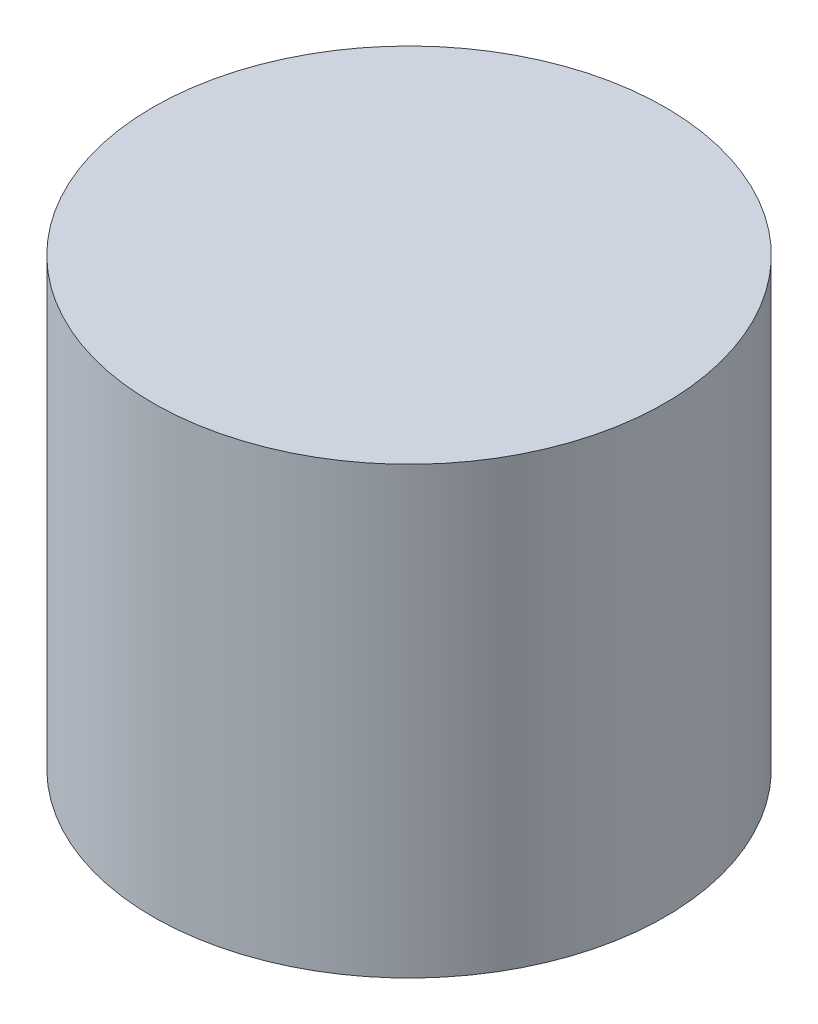
ISO-10303-21;
HEADER;
FILE_DESCRIPTION(('STEP AP214'),'2;1');
FILE_NAME('part.step','',(''),(''),'','','');
FILE_SCHEMA(('AUTOMOTIVE_DESIGN { 1 0 10303 214 1 1 1 1 }'));
ENDSEC;
DATA;
#1=APPLICATION_CONTEXT('core data for automotive mechanical design processes');
#2=APPLICATION_PROTOCOL_DEFINITION('international standard','automotive_design',2000,#1);
#3=PRODUCT_CONTEXT('',#1,'mechanical');
#4=PRODUCT('Part','Part','',(#3));
#5=PRODUCT_RELATED_PRODUCT_CATEGORY('part','',(#4));
#6=PRODUCT_DEFINITION_FORMATION('','',#4);
#7=PRODUCT_DEFINITION_CONTEXT('part definition',#1,'design');
#8=PRODUCT_DEFINITION('design','',#6,#7);
#9=PRODUCT_DEFINITION_SHAPE('','',#8);
#10=(LENGTH_UNIT() NAMED_UNIT(*) SI_UNIT(.MILLI.,.METRE.));
#11=(NAMED_UNIT(*) PLANE_ANGLE_UNIT() SI_UNIT($,.RADIAN.));
#12=(NAMED_UNIT(*) SI_UNIT($,.STERADIAN.) SOLID_ANGLE_UNIT());
#13=UNCERTAINTY_MEASURE_WITH_UNIT(LENGTH_MEASURE(1.E-05),#10,'distance_accuracy_value','');
#14=(GEOMETRIC_REPRESENTATION_CONTEXT(3) GLOBAL_UNCERTAINTY_ASSIGNED_CONTEXT((#13)) GLOBAL_UNIT_ASSIGNED_CONTEXT((#10,
#11,#12)) REPRESENTATION_CONTEXT('',''));
#15=CARTESIAN_POINT('',(0.,0.,0.));
#16=DIRECTION('',(0.,0.,1.));
#17=DIRECTION('',(1.,0.,0.));
#18=AXIS2_PLACEMENT_3D('',#15,#16,#17);
#19=CARTESIAN_POINT('',(-3.4853969136004,40.35,-112.945812440061));
#20=DIRECTION('',(0.,1.,0.));
#21=DIRECTION('',(1.,0.,0.));
#22=AXIS2_PLACEMENT_3D('',#19,#20,#21);
#23=PLANE('',#22);
#24=CARTESIAN_POINT('',(-3.4853969136004,40.35,-112.945812440061));
#25=DIRECTION('',(0.,-1.,0.));
#26=DIRECTION('',(1.,0.,0.));
#27=AXIS2_PLACEMENT_3D('',#24,#25,#26);
#28=CIRCLE('',#27,4.98038476934364);
#29=CARTESIAN_POINT('',(-8.46578168294404,40.35,-112.945812440061));
#30=VERTEX_POINT('',#29);
#31=EDGE_CURVE('E41',#30,#30,#28,.T.);
#32=ORIENTED_EDGE('',*,*,#31,.F.);
#33=EDGE_LOOP('',(#32));
#34=FACE_BOUND('',#33,.T.);
#35=ADVANCED_FACE('F17',(#34),#23,.T.);
#36=CARTESIAN_POINT('',(-3.4853969136004,31.7,-112.945812440061));
#37=DIRECTION('',(0.,1.,0.));
#38=DIRECTION('',(1.,0.,0.));
#39=AXIS2_PLACEMENT_3D('',#36,#37,#38);
#40=PLANE('',#39);
#41=CARTESIAN_POINT('',(-3.4853969136004,31.7,-112.945812440061));
#42=DIRECTION('',(0.,1.,0.));
#43=DIRECTION('',(1.,0.,0.));
#44=AXIS2_PLACEMENT_3D('',#41,#42,#43);
#45=CIRCLE('',#44,4.98038476934364);
#46=CARTESIAN_POINT('',(-8.46578168294404,31.7,-112.945812440061));
#47=VERTEX_POINT('',#46);
#48=EDGE_CURVE('E11',#47,#47,#45,.T.);
#49=ORIENTED_EDGE('',*,*,#48,.F.);
#50=EDGE_LOOP('',(#49));
#51=FACE_BOUND('',#50,.T.);
#52=ADVANCED_FACE('F55',(#51),#40,.F.);
#53=CARTESIAN_POINT('',(-3.4853969136004,31.7,-112.945812440061));
#54=DIRECTION('',(0.,1.,0.));
#55=DIRECTION('',(1.,0.,0.));
#56=AXIS2_PLACEMENT_3D('',#53,#54,#55);
#57=CYLINDRICAL_SURFACE('',#56,4.98038476934364);
#58=ORIENTED_EDGE('',*,*,#31,.T.);
#59=DIRECTION('',(0.,-1.,0.));
#60=VECTOR('',#59,1.);
#61=CARTESIAN_POINT('',(-8.46578168294404,31.7,-112.945812440061));
#62=LINE('',#61,#60);
#63=EDGE_CURVE('E25',#30,#47,#62,.T.);
#64=ORIENTED_EDGE('',*,*,#63,.T.);
#65=ORIENTED_EDGE('',*,*,#48,.T.);
#66=ORIENTED_EDGE('',*,*,#63,.F.);
#67=EDGE_LOOP('',(#58,#64,#65,#66));
#68=FACE_BOUND('',#67,.T.);
#69=ADVANCED_FACE('F39',(#68),#57,.T.);
#70=CLOSED_SHELL('',(#35,#52,#69));
#71=MANIFOLD_SOLID_BREP('B1',#70);
#72=ADVANCED_BREP_SHAPE_REPRESENTATION('',(#18,#71),#14);
#73=SHAPE_DEFINITION_REPRESENTATION(#9,#72);
ENDSEC;
END-ISO-10303-21;
